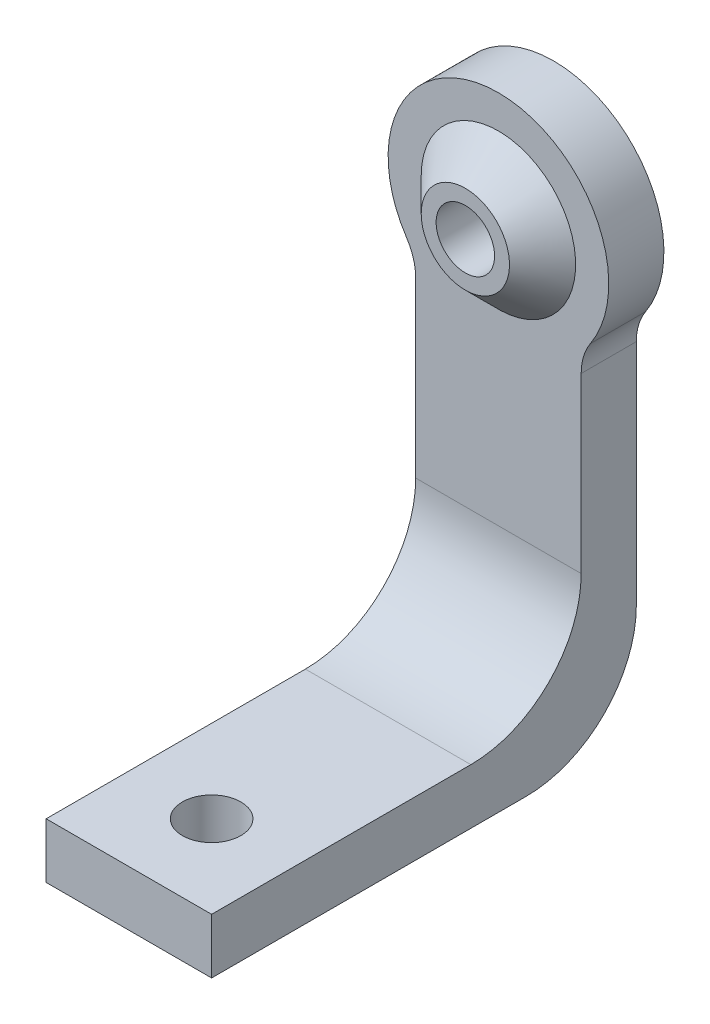
ISO-10303-21;
HEADER;
FILE_DESCRIPTION(('STEP AP214'),'2;1');
FILE_NAME('part.step','',(''),(''),'','','');
FILE_SCHEMA(('AUTOMOTIVE_DESIGN { 1 0 10303 214 1 1 1 1 }'));
ENDSEC;
DATA;
#1=APPLICATION_CONTEXT('core data for automotive mechanical design processes');
#2=APPLICATION_PROTOCOL_DEFINITION('international standard','automotive_design',2000,#1);
#3=PRODUCT_CONTEXT('',#1,'mechanical');
#4=PRODUCT('Part','Part','',(#3));
#5=PRODUCT_RELATED_PRODUCT_CATEGORY('part','',(#4));
#6=PRODUCT_DEFINITION_FORMATION('','',#4);
#7=PRODUCT_DEFINITION_CONTEXT('part definition',#1,'design');
#8=PRODUCT_DEFINITION('design','',#6,#7);
#9=PRODUCT_DEFINITION_SHAPE('','',#8);
#10=(LENGTH_UNIT() NAMED_UNIT(*) SI_UNIT(.MILLI.,.METRE.));
#11=(NAMED_UNIT(*) PLANE_ANGLE_UNIT() SI_UNIT($,.RADIAN.));
#12=(NAMED_UNIT(*) SI_UNIT($,.STERADIAN.) SOLID_ANGLE_UNIT());
#13=UNCERTAINTY_MEASURE_WITH_UNIT(LENGTH_MEASURE(1.E-05),#10,'distance_accuracy_value','');
#14=(GEOMETRIC_REPRESENTATION_CONTEXT(3) GLOBAL_UNCERTAINTY_ASSIGNED_CONTEXT((#13)) GLOBAL_UNIT_ASSIGNED_CONTEXT((#10,
#11,#12)) REPRESENTATION_CONTEXT('',''));
#15=CARTESIAN_POINT('',(0.,0.,0.));
#16=DIRECTION('',(0.,0.,1.));
#17=DIRECTION('',(1.,0.,0.));
#18=AXIS2_PLACEMENT_3D('',#15,#16,#17);
#19=CARTESIAN_POINT('',(7.5,-2.5,0.));
#20=DIRECTION('',(0.,-1.,0.));
#21=DIRECTION('',(0.,0.,-1.));
#22=AXIS2_PLACEMENT_3D('',#19,#20,#21);
#23=PLANE('',#22);
#24=CARTESIAN_POINT('',(0.,-2.5,9.25));
#25=DIRECTION('',(0.,-1.,0.));
#26=DIRECTION('',(0.,0.,-1.));
#27=AXIS2_PLACEMENT_3D('',#24,#25,#26);
#28=CIRCLE('',#27,7.00000000000001);
#29=CARTESIAN_POINT('',(0.,-2.5,2.24999999999999));
#30=VERTEX_POINT('',#29);
#31=EDGE_CURVE('E12',#30,#30,#28,.F.);
#32=ORIENTED_EDGE('',*,*,#31,.T.);
#33=EDGE_LOOP('',(#32));
#34=FACE_BOUND('',#33,.T.);
#35=DIRECTION('',(0.,0.,1.));
#36=VECTOR('',#35,1.);
#37=CARTESIAN_POINT('',(-7.5,-2.5,0.));
#38=LINE('',#37,#36);
#39=CARTESIAN_POINT('',(-7.5,-2.5,-11.75));
#40=VERTEX_POINT('',#39);
#41=CARTESIAN_POINT('',(-7.5,-2.5,16.75));
#42=VERTEX_POINT('',#41);
#43=EDGE_CURVE('E202',#40,#42,#38,.T.);
#44=ORIENTED_EDGE('',*,*,#43,.F.);
#45=DIRECTION('',(-1.,0.,0.));
#46=VECTOR('',#45,1.);
#47=CARTESIAN_POINT('',(7.5,-2.5,-11.75));
#48=LINE('',#47,#46);
#49=CARTESIAN_POINT('',(7.5,-2.5,-11.75));
#50=VERTEX_POINT('',#49);
#51=EDGE_CURVE('E230',#40,#50,#48,.F.);
#52=ORIENTED_EDGE('',*,*,#51,.T.);
#53=DIRECTION('',(0.,0.,1.));
#54=VECTOR('',#53,1.);
#55=CARTESIAN_POINT('',(7.5,-2.5,0.));
#56=LINE('',#55,#54);
#57=CARTESIAN_POINT('',(7.5,-2.5,16.75));
#58=VERTEX_POINT('',#57);
#59=EDGE_CURVE('E217',#50,#58,#56,.T.);
#60=ORIENTED_EDGE('',*,*,#59,.T.);
#61=DIRECTION('',(-1.,0.,0.));
#62=VECTOR('',#61,1.);
#63=CARTESIAN_POINT('',(7.5,-2.5,16.75));
#64=LINE('',#63,#62);
#65=EDGE_CURVE('E198',#58,#42,#64,.T.);
#66=ORIENTED_EDGE('',*,*,#65,.T.);
#67=EDGE_LOOP('',(#44,#52,#60,#66));
#68=FACE_BOUND('',#67,.T.);
#69=ADVANCED_FACE('F97',(#34,#68),#23,.T.);
#70=CARTESIAN_POINT('',(7.5,0.,-16.75));
#71=DIRECTION('',(0.,0.,1.));
#72=DIRECTION('',(1.,0.,0.));
#73=AXIS2_PLACEMENT_3D('',#70,#71,#72);
#74=PLANE('',#73);
#75=CARTESIAN_POINT('',(0.,36.5,-16.75));
#76=DIRECTION('',(0.,0.,1.));
#77=DIRECTION('',(1.,0.,0.));
#78=AXIS2_PLACEMENT_3D('',#75,#76,#77);
#79=CIRCLE('',#78,6.99999999999997);
#80=CARTESIAN_POINT('',(-6.99999999999997,36.5,-16.75));
#81=VERTEX_POINT('',#80);
#82=EDGE_CURVE('E197',#81,#81,#79,.F.);
#83=ORIENTED_EDGE('',*,*,#82,.T.);
#84=EDGE_LOOP('',(#83));
#85=FACE_BOUND('',#84,.T.);
#86=DIRECTION('',(0.,1.,0.));
#87=VECTOR('',#86,1.);
#88=CARTESIAN_POINT('',(-7.5,0.,-16.75));
#89=LINE('',#88,#87);
#90=CARTESIAN_POINT('',(-7.5,12.5,-16.75));
#91=VERTEX_POINT('',#90);
#92=CARTESIAN_POINT('',(-7.5,28.2084380241115,-16.75));
#93=VERTEX_POINT('',#92);
#94=EDGE_CURVE('E189',#91,#93,#89,.T.);
#95=ORIENTED_EDGE('',*,*,#94,.F.);
#96=DIRECTION('',(-1.,0.,0.));
#97=VECTOR('',#96,1.);
#98=CARTESIAN_POINT('',(7.5,12.5,-16.75));
#99=LINE('',#98,#97);
#100=CARTESIAN_POINT('',(7.5,12.5,-16.75));
#101=VERTEX_POINT('',#100);
#102=EDGE_CURVE('E235',#91,#101,#99,.F.);
#103=ORIENTED_EDGE('',*,*,#102,.T.);
#104=DIRECTION('',(0.,1.,0.));
#105=VECTOR('',#104,1.);
#106=CARTESIAN_POINT('',(7.5,0.,-16.75));
#107=LINE('',#106,#105);
#108=CARTESIAN_POINT('',(7.5,28.2084380241115,-16.75));
#109=VERTEX_POINT('',#108);
#110=EDGE_CURVE('E211',#101,#109,#107,.T.);
#111=ORIENTED_EDGE('',*,*,#110,.T.);
#112=CARTESIAN_POINT('',(12.5,28.2084380241115,-16.75));
#113=DIRECTION('',(0.,0.,1.));
#114=DIRECTION('',(1.,0.,0.));
#115=AXIS2_PLACEMENT_3D('',#112,#113,#114);
#116=CIRCLE('',#115,5.);
#117=CARTESIAN_POINT('',(8.33333333333334,30.9722920160743,-16.75));
#118=VERTEX_POINT('',#117);
#119=EDGE_CURVE('E252',#109,#118,#116,.F.);
#120=ORIENTED_EDGE('',*,*,#119,.T.);
#121=CARTESIAN_POINT('',(0.,36.5,-16.75));
#122=DIRECTION('',(0.,0.,1.));
#123=DIRECTION('',(1.,0.,0.));
#124=AXIS2_PLACEMENT_3D('',#121,#122,#123);
#125=CIRCLE('',#124,10.);
#126=CARTESIAN_POINT('',(-8.33333333333334,30.9722920160743,-16.75));
#127=VERTEX_POINT('',#126);
#128=EDGE_CURVE('E265',#118,#127,#125,.T.);
#129=ORIENTED_EDGE('',*,*,#128,.T.);
#130=CARTESIAN_POINT('',(-12.5,28.2084380241115,-16.75));
#131=DIRECTION('',(0.,0.,1.));
#132=DIRECTION('',(1.,0.,0.));
#133=AXIS2_PLACEMENT_3D('',#130,#131,#132);
#134=CIRCLE('',#133,5.);
#135=EDGE_CURVE('E106',#127,#93,#134,.F.);
#136=ORIENTED_EDGE('',*,*,#135,.T.);
#137=EDGE_LOOP('',(#95,#103,#111,#120,#129,#136));
#138=FACE_BOUND('',#137,.T.);
#139=ADVANCED_FACE('F304',(#85,#138),#74,.T.);
#140=CARTESIAN_POINT('',(7.5,2.5,0.));
#141=DIRECTION('',(0.,-1.,0.));
#142=DIRECTION('',(0.,0.,-1.));
#143=AXIS2_PLACEMENT_3D('',#140,#141,#142);
#144=PLANE('',#143);
#145=CARTESIAN_POINT('',(0.,2.5,9.25));
#146=DIRECTION('',(0.,1.,0.));
#147=DIRECTION('',(0.,0.,1.));
#148=AXIS2_PLACEMENT_3D('',#145,#146,#147);
#149=CIRCLE('',#148,2.65);
#150=CARTESIAN_POINT('',(0.,2.5,11.9));
#151=VERTEX_POINT('',#150);
#152=EDGE_CURVE('E280',#151,#151,#149,.T.);
#153=ORIENTED_EDGE('',*,*,#152,.F.);
#154=EDGE_LOOP('',(#153));
#155=FACE_BOUND('',#154,.T.);
#156=DIRECTION('',(0.,0.,1.));
#157=VECTOR('',#156,1.);
#158=CARTESIAN_POINT('',(7.5,2.5,0.));
#159=LINE('',#158,#157);
#160=CARTESIAN_POINT('',(7.5,2.5,-6.75));
#161=VERTEX_POINT('',#160);
#162=CARTESIAN_POINT('',(7.5,2.5,16.75));
#163=VERTEX_POINT('',#162);
#164=EDGE_CURVE('E214',#161,#163,#159,.T.);
#165=ORIENTED_EDGE('',*,*,#164,.F.);
#166=DIRECTION('',(-1.,0.,0.));
#167=VECTOR('',#166,1.);
#168=CARTESIAN_POINT('',(7.5,2.5,-6.75));
#169=LINE('',#168,#167);
#170=CARTESIAN_POINT('',(-7.5,2.5,-6.75));
#171=VERTEX_POINT('',#170);
#172=EDGE_CURVE('E185',#161,#171,#169,.T.);
#173=ORIENTED_EDGE('',*,*,#172,.T.);
#174=DIRECTION('',(0.,0.,1.));
#175=VECTOR('',#174,1.);
#176=CARTESIAN_POINT('',(-7.5,2.5,0.));
#177=LINE('',#176,#175);
#178=CARTESIAN_POINT('',(-7.5,2.5,16.75));
#179=VERTEX_POINT('',#178);
#180=EDGE_CURVE('E178',#171,#179,#177,.T.);
#181=ORIENTED_EDGE('',*,*,#180,.T.);
#182=DIRECTION('',(-1.,0.,0.));
#183=VECTOR('',#182,1.);
#184=CARTESIAN_POINT('',(7.5,2.5,16.75));
#185=LINE('',#184,#183);
#186=EDGE_CURVE('E182',#163,#179,#185,.T.);
#187=ORIENTED_EDGE('',*,*,#186,.F.);
#188=EDGE_LOOP('',(#165,#173,#181,#187));
#189=FACE_BOUND('',#188,.T.);
#190=ADVANCED_FACE('F181',(#155,#189),#144,.F.);
#191=CARTESIAN_POINT('',(7.5,0.,16.75));
#192=DIRECTION('',(0.,0.,-1.));
#193=DIRECTION('',(-1.,0.,0.));
#194=AXIS2_PLACEMENT_3D('',#191,#192,#193);
#195=PLANE('',#194);
#196=ORIENTED_EDGE('',*,*,#186,.T.);
#197=DIRECTION('',(0.,-1.,0.));
#198=VECTOR('',#197,1.);
#199=CARTESIAN_POINT('',(-7.5,0.,16.75));
#200=LINE('',#199,#198);
#201=EDGE_CURVE('E188',#179,#42,#200,.T.);
#202=ORIENTED_EDGE('',*,*,#201,.T.);
#203=ORIENTED_EDGE('',*,*,#65,.F.);
#204=DIRECTION('',(0.,-1.,0.));
#205=VECTOR('',#204,1.);
#206=CARTESIAN_POINT('',(7.5,0.,16.75));
#207=LINE('',#206,#205);
#208=EDGE_CURVE('E196',#163,#58,#207,.T.);
#209=ORIENTED_EDGE('',*,*,#208,.F.);
#210=EDGE_LOOP('',(#196,#202,#203,#209));
#211=FACE_BOUND('',#210,.T.);
#212=ADVANCED_FACE('F193',(#211),#195,.F.);
#213=CARTESIAN_POINT('',(7.5,0.,-21.75));
#214=DIRECTION('',(0.,0.,1.));
#215=DIRECTION('',(1.,0.,0.));
#216=AXIS2_PLACEMENT_3D('',#213,#214,#215);
#217=PLANE('',#216);
#218=CARTESIAN_POINT('',(0.,36.5,-21.75));
#219=DIRECTION('',(0.,0.,-1.));
#220=DIRECTION('',(-1.,0.,0.));
#221=AXIS2_PLACEMENT_3D('',#218,#219,#220);
#222=CIRCLE('',#221,2.65);
#223=CARTESIAN_POINT('',(-2.65,36.5,-21.75));
#224=VERTEX_POINT('',#223);
#225=EDGE_CURVE('E270',#224,#224,#222,.T.);
#226=ORIENTED_EDGE('',*,*,#225,.F.);
#227=EDGE_LOOP('',(#226));
#228=FACE_BOUND('',#227,.T.);
#229=DIRECTION('',(0.,1.,0.));
#230=VECTOR('',#229,1.);
#231=CARTESIAN_POINT('',(7.5,0.,-21.75));
#232=LINE('',#231,#230);
#233=CARTESIAN_POINT('',(7.5,7.5,-21.75));
#234=VERTEX_POINT('',#233);
#235=CARTESIAN_POINT('',(7.5,28.2084380241115,-21.75));
#236=VERTEX_POINT('',#235);
#237=EDGE_CURVE('E219',#234,#236,#232,.T.);
#238=ORIENTED_EDGE('',*,*,#237,.F.);
#239=DIRECTION('',(-1.,0.,0.));
#240=VECTOR('',#239,1.);
#241=CARTESIAN_POINT('',(-7.5,7.5,-21.75));
#242=LINE('',#241,#240);
#243=CARTESIAN_POINT('',(-7.5,7.5,-21.75));
#244=VERTEX_POINT('',#243);
#245=EDGE_CURVE('E225',#234,#244,#242,.T.);
#246=ORIENTED_EDGE('',*,*,#245,.T.);
#247=DIRECTION('',(0.,1.,0.));
#248=VECTOR('',#247,1.);
#249=CARTESIAN_POINT('',(-7.5,0.,-21.75));
#250=LINE('',#249,#248);
#251=CARTESIAN_POINT('',(-7.5,28.2084380241115,-21.75));
#252=VERTEX_POINT('',#251);
#253=EDGE_CURVE('E205',#244,#252,#250,.T.);
#254=ORIENTED_EDGE('',*,*,#253,.T.);
#255=CARTESIAN_POINT('',(-12.5,28.2084380241115,-21.75));
#256=DIRECTION('',(0.,0.,1.));
#257=DIRECTION('',(1.,0.,0.));
#258=AXIS2_PLACEMENT_3D('',#255,#256,#257);
#259=CIRCLE('',#258,5.);
#260=CARTESIAN_POINT('',(-8.33333333333334,30.9722920160743,-21.75));
#261=VERTEX_POINT('',#260);
#262=EDGE_CURVE('E120',#252,#261,#259,.T.);
#263=ORIENTED_EDGE('',*,*,#262,.T.);
#264=CARTESIAN_POINT('',(0.,36.5,-21.75));
#265=DIRECTION('',(0.,0.,1.));
#266=DIRECTION('',(1.,0.,0.));
#267=AXIS2_PLACEMENT_3D('',#264,#265,#266);
#268=CIRCLE('',#267,10.);
#269=CARTESIAN_POINT('',(8.33333333333334,30.9722920160743,-21.75));
#270=VERTEX_POINT('',#269);
#271=EDGE_CURVE('E259',#270,#261,#268,.T.);
#272=ORIENTED_EDGE('',*,*,#271,.F.);
#273=CARTESIAN_POINT('',(12.5,28.2084380241115,-21.75));
#274=DIRECTION('',(0.,0.,1.));
#275=DIRECTION('',(1.,0.,0.));
#276=AXIS2_PLACEMENT_3D('',#273,#274,#275);
#277=CIRCLE('',#276,5.);
#278=EDGE_CURVE('E250',#270,#236,#277,.T.);
#279=ORIENTED_EDGE('',*,*,#278,.T.);
#280=EDGE_LOOP('',(#238,#246,#254,#263,#272,#279));
#281=FACE_BOUND('',#280,.T.);
#282=ADVANCED_FACE('F258',(#228,#281),#217,.F.);
#283=CARTESIAN_POINT('',(7.5,0.,0.));
#284=DIRECTION('',(1.,0.,0.));
#285=DIRECTION('',(0.,0.,-1.));
#286=AXIS2_PLACEMENT_3D('',#283,#284,#285);
#287=PLANE('',#286);
#288=ORIENTED_EDGE('',*,*,#237,.T.);
#289=DIRECTION('',(0.,0.,-1.));
#290=VECTOR('',#289,1.);
#291=CARTESIAN_POINT('',(7.5,28.2084380241115,-16.75));
#292=LINE('',#291,#290);
#293=EDGE_CURVE('E246',#236,#109,#292,.F.);
#294=ORIENTED_EDGE('',*,*,#293,.T.);
#295=ORIENTED_EDGE('',*,*,#110,.F.);
#296=CARTESIAN_POINT('',(7.5,12.5,-6.75));
#297=DIRECTION('',(1.,0.,0.));
#298=DIRECTION('',(0.,0.,-1.));
#299=AXIS2_PLACEMENT_3D('',#296,#297,#298);
#300=CIRCLE('',#299,10.);
#301=EDGE_CURVE('E239',#101,#161,#300,.F.);
#302=ORIENTED_EDGE('',*,*,#301,.T.);
#303=ORIENTED_EDGE('',*,*,#164,.T.);
#304=ORIENTED_EDGE('',*,*,#208,.T.);
#305=ORIENTED_EDGE('',*,*,#59,.F.);
#306=CARTESIAN_POINT('',(7.5,7.5,-11.75));
#307=DIRECTION('',(1.,0.,0.));
#308=DIRECTION('',(0.,0.,-1.));
#309=AXIS2_PLACEMENT_3D('',#306,#307,#308);
#310=CIRCLE('',#309,10.);
#311=EDGE_CURVE('E232',#50,#234,#310,.T.);
#312=ORIENTED_EDGE('',*,*,#311,.T.);
#313=EDGE_LOOP('',(#288,#294,#295,#302,#303,#304,#305,#312));
#314=FACE_BOUND('',#313,.T.);
#315=ADVANCED_FACE('F435',(#314),#287,.T.);
#316=CARTESIAN_POINT('',(-7.5,0.,0.));
#317=DIRECTION('',(1.,0.,0.));
#318=DIRECTION('',(0.,0.,-1.));
#319=AXIS2_PLACEMENT_3D('',#316,#317,#318);
#320=PLANE('',#319);
#321=ORIENTED_EDGE('',*,*,#94,.T.);
#322=DIRECTION('',(0.,0.,1.));
#323=VECTOR('',#322,1.);
#324=CARTESIAN_POINT('',(-7.5,28.2084380241115,0.));
#325=LINE('',#324,#323);
#326=EDGE_CURVE('E248',#93,#252,#325,.F.);
#327=ORIENTED_EDGE('',*,*,#326,.T.);
#328=ORIENTED_EDGE('',*,*,#253,.F.);
#329=CARTESIAN_POINT('',(-7.5,7.5,-11.75));
#330=DIRECTION('',(1.,0.,0.));
#331=DIRECTION('',(0.,0.,-1.));
#332=AXIS2_PLACEMENT_3D('',#329,#330,#331);
#333=CIRCLE('',#332,10.);
#334=EDGE_CURVE('E228',#244,#40,#333,.F.);
#335=ORIENTED_EDGE('',*,*,#334,.T.);
#336=ORIENTED_EDGE('',*,*,#43,.T.);
#337=ORIENTED_EDGE('',*,*,#201,.F.);
#338=ORIENTED_EDGE('',*,*,#180,.F.);
#339=CARTESIAN_POINT('',(-7.5,12.5,-6.75));
#340=DIRECTION('',(1.,0.,0.));
#341=DIRECTION('',(0.,0.,-1.));
#342=AXIS2_PLACEMENT_3D('',#339,#340,#341);
#343=CIRCLE('',#342,10.);
#344=EDGE_CURVE('E237',#171,#91,#343,.T.);
#345=ORIENTED_EDGE('',*,*,#344,.T.);
#346=EDGE_LOOP('',(#321,#327,#328,#335,#336,#337,#338,#345));
#347=FACE_BOUND('',#346,.T.);
#348=ADVANCED_FACE('F200',(#347),#320,.F.);
#349=CARTESIAN_POINT('',(0.,36.5,-21.75));
#350=DIRECTION('',(0.,0.,1.));
#351=DIRECTION('',(1.,0.,0.));
#352=AXIS2_PLACEMENT_3D('',#349,#350,#351);
#353=CYLINDRICAL_SURFACE('',#352,10.);
#354=ORIENTED_EDGE('',*,*,#128,.F.);
#355=DIRECTION('',(0.,0.,1.));
#356=VECTOR('',#355,1.);
#357=CARTESIAN_POINT('',(8.33333333333334,30.9722920160743,-21.75));
#358=LINE('',#357,#356);
#359=EDGE_CURVE('E243',#118,#270,#358,.F.);
#360=ORIENTED_EDGE('',*,*,#359,.T.);
#361=ORIENTED_EDGE('',*,*,#271,.T.);
#362=DIRECTION('',(0.,0.,1.));
#363=VECTOR('',#362,1.);
#364=CARTESIAN_POINT('',(-8.33333333333334,30.9722920160743,-21.75));
#365=LINE('',#364,#363);
#366=EDGE_CURVE('E241',#261,#127,#365,.T.);
#367=ORIENTED_EDGE('',*,*,#366,.T.);
#368=EDGE_LOOP('',(#354,#360,#361,#367));
#369=FACE_BOUND('',#368,.T.);
#370=ADVANCED_FACE('F263',(#369),#353,.T.);
#371=CARTESIAN_POINT('',(0.,36.5,-16.75));
#372=DIRECTION('',(0.,0.,-1.));
#373=DIRECTION('',(-1.,0.,0.));
#374=AXIS2_PLACEMENT_3D('',#371,#372,#373);
#375=CYLINDRICAL_SURFACE('',#374,2.65);
#376=ORIENTED_EDGE('',*,*,#225,.T.);
#377=EDGE_LOOP('',(#376));
#378=FACE_BOUND('',#377,.T.);
#379=CARTESIAN_POINT('',(0.,36.5,-13.75));
#380=DIRECTION('',(0.,0.,1.));
#381=DIRECTION('',(1.,0.,0.));
#382=AXIS2_PLACEMENT_3D('',#379,#380,#381);
#383=CIRCLE('',#382,2.65);
#384=CARTESIAN_POINT('',(2.65,36.5,-13.75));
#385=VERTEX_POINT('',#384);
#386=EDGE_CURVE('E277',#385,#385,#383,.T.);
#387=ORIENTED_EDGE('',*,*,#386,.T.);
#388=EDGE_LOOP('',(#387));
#389=FACE_BOUND('',#388,.T.);
#390=ADVANCED_FACE('F405',(#378,#389),#375,.F.);
#391=CARTESIAN_POINT('',(0.,36.5,-13.75));
#392=DIRECTION('',(0.,0.,1.));
#393=DIRECTION('',(1.,0.,0.));
#394=AXIS2_PLACEMENT_3D('',#391,#392,#393);
#395=PLANE('',#394);
#396=CARTESIAN_POINT('',(0.,36.5,-13.75));
#397=DIRECTION('',(0.,0.,1.));
#398=DIRECTION('',(1.,0.,0.));
#399=AXIS2_PLACEMENT_3D('',#396,#397,#398);
#400=CIRCLE('',#399,3.99999999999999);
#401=CARTESIAN_POINT('',(-4.,36.5,-13.75));
#402=VERTEX_POINT('',#401);
#403=EDGE_CURVE('E274',#402,#402,#400,.T.);
#404=ORIENTED_EDGE('',*,*,#403,.T.);
#405=EDGE_LOOP('',(#404));
#406=FACE_BOUND('',#405,.T.);
#407=ORIENTED_EDGE('',*,*,#386,.F.);
#408=EDGE_LOOP('',(#407));
#409=FACE_BOUND('',#408,.T.);
#410=ADVANCED_FACE('F328',(#406,#409),#395,.T.);
#411=CARTESIAN_POINT('',(0.,36.5,-13.75));
#412=DIRECTION('',(0.,0.,-1.));
#413=DIRECTION('',(-1.,0.,0.));
#414=AXIS2_PLACEMENT_3D('',#411,#412,#413);
#415=CONICAL_SURFACE('',#414,3.99999999999999,0.785398163397444);
#416=CARTESIAN_POINT('',(-6.99999999999997,36.5,-16.75));
#417=CARTESIAN_POINT('',(-6.96874999999997,36.5,-16.71875));
#418=CARTESIAN_POINT('',(-6.93749999999997,36.5,-16.6875));
#419=CARTESIAN_POINT('',(-6.87499999999997,36.5,-16.625));
#420=CARTESIAN_POINT('',(-6.84374999999997,36.5,-16.59375));
#421=CARTESIAN_POINT('',(-6.78124999999998,36.5,-16.53125));
#422=CARTESIAN_POINT('',(-6.74999999999998,36.5,-16.5));
#423=CARTESIAN_POINT('',(-6.68749999999998,36.5,-16.4375));
#424=CARTESIAN_POINT('',(-6.65624999999998,36.5,-16.40625));
#425=CARTESIAN_POINT('',(-6.59374999999998,36.5,-16.34375));
#426=CARTESIAN_POINT('',(-6.56249999999998,36.5,-16.3125));
#427=CARTESIAN_POINT('',(-6.49999999999998,36.5,-16.25));
#428=CARTESIAN_POINT('',(-6.46874999999998,36.5,-16.21875));
#429=CARTESIAN_POINT('',(-6.40624999999998,36.5,-16.15625));
#430=CARTESIAN_POINT('',(-6.37499999999998,36.5,-16.125));
#431=CARTESIAN_POINT('',(-6.31249999999998,36.5,-16.0625));
#432=CARTESIAN_POINT('',(-6.28124999999998,36.5,-16.03125));
#433=CARTESIAN_POINT('',(-6.21874999999998,36.5,-15.96875));
#434=CARTESIAN_POINT('',(-6.18749999999998,36.5,-15.9375));
#435=CARTESIAN_POINT('',(-6.12499999999998,36.5,-15.875));
#436=CARTESIAN_POINT('',(-6.09374999999998,36.5,-15.84375));
#437=CARTESIAN_POINT('',(-6.03124999999998,36.5,-15.78125));
#438=CARTESIAN_POINT('',(-5.99999999999998,36.5,-15.75));
#439=CARTESIAN_POINT('',(-5.93749999999998,36.5,-15.6875));
#440=CARTESIAN_POINT('',(-5.90624999999998,36.5,-15.65625));
#441=CARTESIAN_POINT('',(-5.84374999999998,36.5,-15.59375));
#442=CARTESIAN_POINT('',(-5.81249999999998,36.5,-15.5625));
#443=CARTESIAN_POINT('',(-5.74999999999998,36.5,-15.5));
#444=CARTESIAN_POINT('',(-5.71874999999998,36.5,-15.46875));
#445=CARTESIAN_POINT('',(-5.65624999999998,36.5,-15.40625));
#446=CARTESIAN_POINT('',(-5.62499999999999,36.5,-15.375));
#447=CARTESIAN_POINT('',(-5.56249999999999,36.5,-15.3125));
#448=CARTESIAN_POINT('',(-5.53124999999999,36.5,-15.28125));
#449=CARTESIAN_POINT('',(-5.46874999999999,36.5,-15.21875));
#450=CARTESIAN_POINT('',(-5.43749999999999,36.5,-15.1875));
#451=CARTESIAN_POINT('',(-5.37499999999999,36.5,-15.125));
#452=CARTESIAN_POINT('',(-5.34374999999999,36.5,-15.09375));
#453=CARTESIAN_POINT('',(-5.28124999999999,36.5,-15.03125));
#454=CARTESIAN_POINT('',(-5.24999999999999,36.5,-15.));
#455=CARTESIAN_POINT('',(-5.18749999999999,36.5,-14.9375));
#456=CARTESIAN_POINT('',(-5.15624999999999,36.5,-14.90625));
#457=CARTESIAN_POINT('',(-5.09374999999999,36.5,-14.84375));
#458=CARTESIAN_POINT('',(-5.06249999999999,36.5,-14.8125));
#459=CARTESIAN_POINT('',(-4.99999999999999,36.5,-14.75));
#460=CARTESIAN_POINT('',(-4.96874999999999,36.5,-14.71875));
#461=CARTESIAN_POINT('',(-4.90624999999999,36.5,-14.65625));
#462=CARTESIAN_POINT('',(-4.87499999999999,36.5,-14.625));
#463=CARTESIAN_POINT('',(-4.81249999999999,36.5,-14.5625));
#464=CARTESIAN_POINT('',(-4.78124999999999,36.5,-14.53125));
#465=CARTESIAN_POINT('',(-4.71874999999999,36.5,-14.46875));
#466=CARTESIAN_POINT('',(-4.6875,36.5,-14.4375));
#467=CARTESIAN_POINT('',(-4.625,36.5,-14.375));
#468=CARTESIAN_POINT('',(-4.59375,36.5,-14.34375));
#469=CARTESIAN_POINT('',(-4.53125,36.5,-14.28125));
#470=CARTESIAN_POINT('',(-4.5,36.5,-14.25));
#471=CARTESIAN_POINT('',(-4.4375,36.5,-14.1875));
#472=CARTESIAN_POINT('',(-4.40625,36.5,-14.15625));
#473=CARTESIAN_POINT('',(-4.34375,36.5,-14.09375));
#474=CARTESIAN_POINT('',(-4.3125,36.5,-14.0625));
#475=CARTESIAN_POINT('',(-4.25,36.5,-14.));
#476=CARTESIAN_POINT('',(-4.21875,36.5,-13.96875));
#477=CARTESIAN_POINT('',(-4.15625,36.5,-13.90625));
#478=CARTESIAN_POINT('',(-4.125,36.5,-13.875));
#479=CARTESIAN_POINT('',(-4.0625,36.5,-13.8125));
#480=CARTESIAN_POINT('',(-4.03125,36.5,-13.78125));
#481=CARTESIAN_POINT('',(-4.,36.5,-13.75));
#482=B_SPLINE_CURVE_WITH_KNOTS('',3,(#416,#417,#418,#419,#420,#421,#422,#423,#424,#425,#426,
#427,#428,#429,#430,#431,#432,#433,#434,#435,#436,#437,#438,#439,#440,#441,#442,#443,#444,#445,
#446,#447,#448,#449,#450,#451,#452,#453,#454,#455,#456,#457,#458,#459,#460,#461,#462,#463,#464,
#465,#466,#467,#468,#469,#470,#471,#472,#473,#474,#475,#476,#477,#478,#479,#480,#481),
.UNSPECIFIED.,.F.,.F.,(4,2,2,2,2,2,2,2,2,2,2,2,2,2,2,2,2,2,2,2,2,2,2,2,2,2,2,2,2,2,2,2,4),(0.,
0.132582521472477,0.265165042944954,0.397747564417431,0.530330085889906,0.662912607362385,
0.795495128834861,0.92807765030734,1.06066017177981,1.19324269325229,1.32582521472477,
1.45840773619725,1.59099025766972,1.7235727791422,1.85615530061468,1.98873782208715,
2.12132034355963,2.25390286503211,2.38648538650459,2.51906790797706,2.65165042944954,
2.78423295092202,2.91681547239449,3.04939799386697,3.18198051533945,3.31456303681192,
3.4471455582844,3.57972807975688,3.71231060122936,3.84489312270183,3.97747564417431,
4.11005816564679,4.24264068711927),.UNSPECIFIED.);
#483=EDGE_CURVE('BSEAM322',#81,#402,#482,.T.);
#484=ORIENTED_EDGE('',*,*,#82,.F.);
#485=ORIENTED_EDGE('',*,*,#403,.F.);
#486=ORIENTED_EDGE('',*,*,#483,.T.);
#487=ORIENTED_EDGE('',*,*,#483,.F.);
#488=EDGE_LOOP('',(#484,#486,#485,#487));
#489=FACE_BOUND('',#488,.T.);
#490=ADVANCED_FACE('F322',(#489),#415,.T.);
#491=CARTESIAN_POINT('',(7.5,7.5,-11.75));
#492=DIRECTION('',(1.,0.,0.));
#493=DIRECTION('',(0.,0.,-1.));
#494=AXIS2_PLACEMENT_3D('',#491,#492,#493);
#495=CYLINDRICAL_SURFACE('',#494,10.);
#496=ORIENTED_EDGE('',*,*,#311,.F.);
#497=ORIENTED_EDGE('',*,*,#51,.F.);
#498=ORIENTED_EDGE('',*,*,#334,.F.);
#499=ORIENTED_EDGE('',*,*,#245,.F.);
#500=EDGE_LOOP('',(#496,#497,#498,#499));
#501=FACE_BOUND('',#500,.T.);
#502=ADVANCED_FACE('F327',(#501),#495,.T.);
#503=CARTESIAN_POINT('',(7.5,12.5,-6.75));
#504=DIRECTION('',(-1.,0.,0.));
#505=DIRECTION('',(0.,0.,1.));
#506=AXIS2_PLACEMENT_3D('',#503,#504,#505);
#507=CYLINDRICAL_SURFACE('',#506,10.);
#508=ORIENTED_EDGE('',*,*,#301,.F.);
#509=ORIENTED_EDGE('',*,*,#102,.F.);
#510=ORIENTED_EDGE('',*,*,#344,.F.);
#511=ORIENTED_EDGE('',*,*,#172,.F.);
#512=EDGE_LOOP('',(#508,#509,#510,#511));
#513=FACE_BOUND('',#512,.T.);
#514=ADVANCED_FACE('F332',(#513),#507,.F.);
#515=CARTESIAN_POINT('',(12.5,28.2084380241115,-21.75));
#516=DIRECTION('',(0.,0.,1.));
#517=DIRECTION('',(1.,0.,0.));
#518=AXIS2_PLACEMENT_3D('',#515,#516,#517);
#519=CYLINDRICAL_SURFACE('',#518,5.);
#520=ORIENTED_EDGE('',*,*,#119,.F.);
#521=ORIENTED_EDGE('',*,*,#293,.F.);
#522=ORIENTED_EDGE('',*,*,#278,.F.);
#523=ORIENTED_EDGE('',*,*,#359,.F.);
#524=EDGE_LOOP('',(#520,#521,#522,#523));
#525=FACE_BOUND('',#524,.T.);
#526=ADVANCED_FACE('F336',(#525),#519,.F.);
#527=CARTESIAN_POINT('',(-12.5,28.2084380241115,-21.75));
#528=DIRECTION('',(0.,0.,1.));
#529=DIRECTION('',(1.,0.,0.));
#530=AXIS2_PLACEMENT_3D('',#527,#528,#529);
#531=CYLINDRICAL_SURFACE('',#530,5.);
#532=ORIENTED_EDGE('',*,*,#135,.F.);
#533=ORIENTED_EDGE('',*,*,#366,.F.);
#534=ORIENTED_EDGE('',*,*,#262,.F.);
#535=ORIENTED_EDGE('',*,*,#326,.F.);
#536=EDGE_LOOP('',(#532,#533,#534,#535));
#537=FACE_BOUND('',#536,.T.);
#538=ADVANCED_FACE('F267',(#537),#531,.F.);
#539=CARTESIAN_POINT('',(0.,-47.5,9.25));
#540=DIRECTION('',(0.,1.,0.));
#541=DIRECTION('',(0.,0.,1.));
#542=AXIS2_PLACEMENT_3D('',#539,#540,#541);
#543=CYLINDRICAL_SURFACE('',#542,2.65);
#544=ORIENTED_EDGE('',*,*,#152,.T.);
#545=EDGE_LOOP('',(#544));
#546=FACE_BOUND('',#545,.T.);
#547=CARTESIAN_POINT('',(0.,-5.5,9.25));
#548=DIRECTION('',(0.,-1.,0.));
#549=DIRECTION('',(0.,0.,-1.));
#550=AXIS2_PLACEMENT_3D('',#547,#548,#549);
#551=CIRCLE('',#550,2.65);
#552=CARTESIAN_POINT('',(0.,-5.5,6.6));
#553=VERTEX_POINT('',#552);
#554=EDGE_CURVE('E286',#553,#553,#551,.T.);
#555=ORIENTED_EDGE('',*,*,#554,.T.);
#556=EDGE_LOOP('',(#555));
#557=FACE_BOUND('',#556,.T.);
#558=ADVANCED_FACE('F290',(#546,#557),#543,.F.);
#559=CARTESIAN_POINT('',(0.,-5.5,9.25));
#560=DIRECTION('',(0.,-1.,0.));
#561=DIRECTION('',(0.,0.,-1.));
#562=AXIS2_PLACEMENT_3D('',#559,#560,#561);
#563=PLANE('',#562);
#564=CARTESIAN_POINT('',(0.,-5.5,9.25));
#565=DIRECTION('',(0.,-1.,0.));
#566=DIRECTION('',(0.,0.,-1.));
#567=AXIS2_PLACEMENT_3D('',#564,#565,#566);
#568=CIRCLE('',#567,4.);
#569=CARTESIAN_POINT('',(0.,-5.5,5.25));
#570=VERTEX_POINT('',#569);
#571=EDGE_CURVE('E283',#570,#570,#568,.T.);
#572=ORIENTED_EDGE('',*,*,#571,.T.);
#573=EDGE_LOOP('',(#572));
#574=FACE_BOUND('',#573,.T.);
#575=ORIENTED_EDGE('',*,*,#554,.F.);
#576=EDGE_LOOP('',(#575));
#577=FACE_BOUND('',#576,.T.);
#578=ADVANCED_FACE('F292',(#574,#577),#563,.T.);
#579=CARTESIAN_POINT('',(0.,-5.50000000000004,9.25));
#580=DIRECTION('',(0.,1.,0.));
#581=DIRECTION('',(0.,0.,1.));
#582=AXIS2_PLACEMENT_3D('',#579,#580,#581);
#583=CONICAL_SURFACE('',#582,4.,0.785398163397443);
#584=ORIENTED_EDGE('',*,*,#31,.F.);
#585=EDGE_LOOP('',(#584));
#586=FACE_BOUND('',#585,.T.);
#587=ORIENTED_EDGE('',*,*,#571,.F.);
#588=EDGE_LOOP('',(#587));
#589=FACE_BOUND('',#588,.T.);
#590=ADVANCED_FACE('F100',(#586,#589),#583,.T.);
#591=CLOSED_SHELL('',(#69,#139,#190,#212,#282,#315,#348,#370,#390,#410,#490,#502,#514,#526,#538,
#558,#578,#590));
#592=MANIFOLD_SOLID_BREP('B2',#591);
#593=ADVANCED_BREP_SHAPE_REPRESENTATION('',(#18,#592),#14);
#594=SHAPE_DEFINITION_REPRESENTATION(#9,#593);
ENDSEC;
END-ISO-10303-21;
